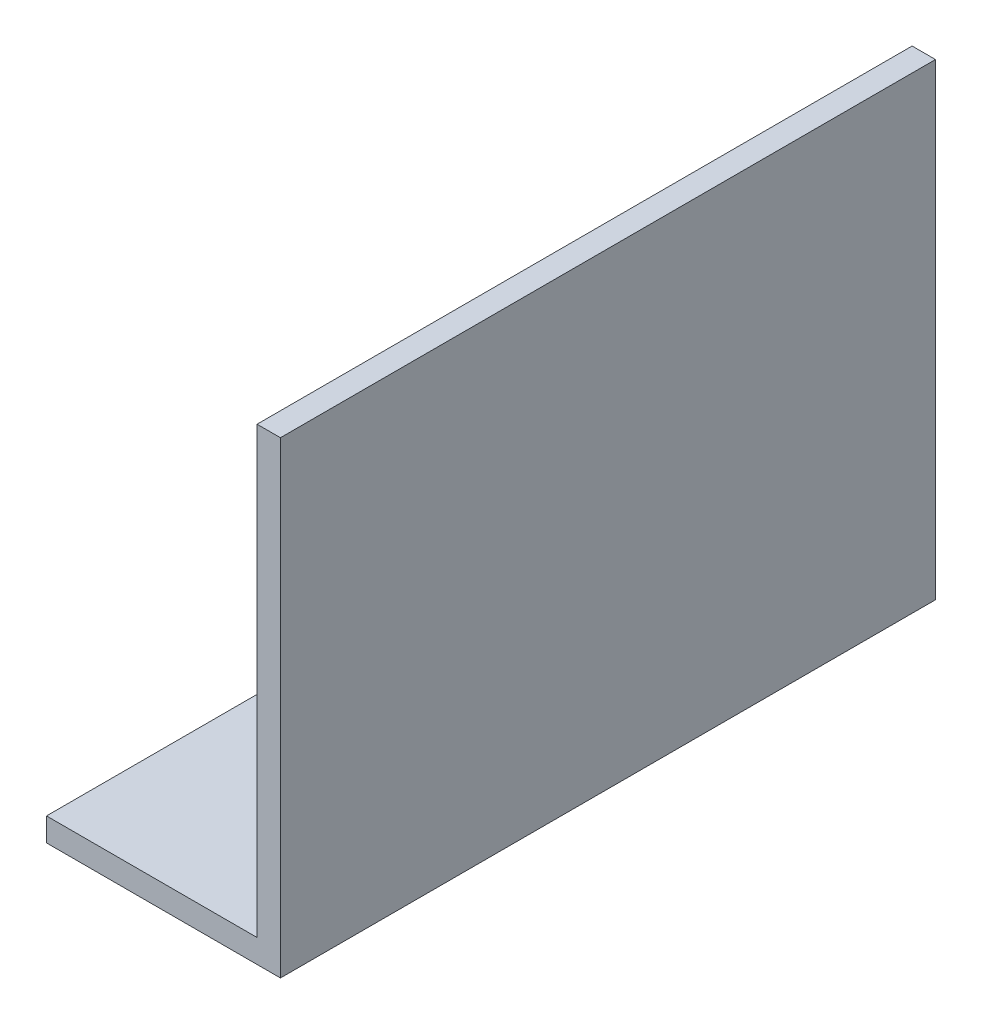
ISO-10303-21;
HEADER;
FILE_DESCRIPTION(('STEP AP214'),'2;1');
FILE_NAME('part.step','',(''),(''),'','','');
FILE_SCHEMA(('AUTOMOTIVE_DESIGN { 1 0 10303 214 1 1 1 1 }'));
ENDSEC;
DATA;
#1=APPLICATION_CONTEXT('core data for automotive mechanical design processes');
#2=APPLICATION_PROTOCOL_DEFINITION('international standard','automotive_design',2000,#1);
#3=PRODUCT_CONTEXT('',#1,'mechanical');
#4=PRODUCT('Part','Part','',(#3));
#5=PRODUCT_RELATED_PRODUCT_CATEGORY('part','',(#4));
#6=PRODUCT_DEFINITION_FORMATION('','',#4);
#7=PRODUCT_DEFINITION_CONTEXT('part definition',#1,'design');
#8=PRODUCT_DEFINITION('design','',#6,#7);
#9=PRODUCT_DEFINITION_SHAPE('','',#8);
#10=(LENGTH_UNIT() NAMED_UNIT(*) SI_UNIT(.MILLI.,.METRE.));
#11=(NAMED_UNIT(*) PLANE_ANGLE_UNIT() SI_UNIT($,.RADIAN.));
#12=(NAMED_UNIT(*) SI_UNIT($,.STERADIAN.) SOLID_ANGLE_UNIT());
#13=UNCERTAINTY_MEASURE_WITH_UNIT(LENGTH_MEASURE(1.E-05),#10,'distance_accuracy_value','');
#14=(GEOMETRIC_REPRESENTATION_CONTEXT(3) GLOBAL_UNCERTAINTY_ASSIGNED_CONTEXT((#13)) GLOBAL_UNIT_ASSIGNED_CONTEXT((#10,
#11,#12)) REPRESENTATION_CONTEXT('',''));
#15=CARTESIAN_POINT('',(0.,0.,0.));
#16=DIRECTION('',(0.,0.,1.));
#17=DIRECTION('',(1.,0.,0.));
#18=AXIS2_PLACEMENT_3D('',#15,#16,#17);
#19=CARTESIAN_POINT('',(-5.,0.,140.));
#20=DIRECTION('',(0.,-1.,0.));
#21=DIRECTION('',(0.,0.,-1.));
#22=AXIS2_PLACEMENT_3D('',#19,#20,#21);
#23=PLANE('',#22);
#24=DIRECTION('',(-1.,0.,0.));
#25=VECTOR('',#24,1.);
#26=CARTESIAN_POINT('',(-5.,0.,0.));
#27=LINE('',#26,#25);
#28=CARTESIAN_POINT('',(0.,0.,0.));
#29=VERTEX_POINT('',#28);
#30=CARTESIAN_POINT('',(-5.,0.,0.));
#31=VERTEX_POINT('',#30);
#32=EDGE_CURVE('E128',#29,#31,#27,.T.);
#33=ORIENTED_EDGE('',*,*,#32,.T.);
#34=DIRECTION('',(0.,0.,-1.));
#35=VECTOR('',#34,1.);
#36=CARTESIAN_POINT('',(-5.,0.,140.));
#37=LINE('',#36,#35);
#38=CARTESIAN_POINT('',(-5.,0.,140.));
#39=VERTEX_POINT('',#38);
#40=EDGE_CURVE('E11',#39,#31,#37,.T.);
#41=ORIENTED_EDGE('',*,*,#40,.F.);
#42=DIRECTION('',(-1.,0.,0.));
#43=VECTOR('',#42,1.);
#44=CARTESIAN_POINT('',(-5.,0.,140.));
#45=LINE('',#44,#43);
#46=CARTESIAN_POINT('',(0.,0.,140.));
#47=VERTEX_POINT('',#46);
#48=EDGE_CURVE('E144',#47,#39,#45,.T.);
#49=ORIENTED_EDGE('',*,*,#48,.F.);
#50=DIRECTION('',(0.,0.,-1.));
#51=VECTOR('',#50,1.);
#52=CARTESIAN_POINT('',(0.,0.,140.));
#53=LINE('',#52,#51);
#54=EDGE_CURVE('E124',#47,#29,#53,.T.);
#55=ORIENTED_EDGE('',*,*,#54,.T.);
#56=EDGE_LOOP('',(#33,#41,#49,#55));
#57=FACE_BOUND('',#56,.T.);
#58=ADVANCED_FACE('F39',(#57),#23,.F.);
#59=CARTESIAN_POINT('',(-5.,-95.,140.));
#60=DIRECTION('',(1.,0.,0.));
#61=DIRECTION('',(0.,1.,0.));
#62=AXIS2_PLACEMENT_3D('',#59,#60,#61);
#63=PLANE('',#62);
#64=DIRECTION('',(0.,-1.,0.));
#65=VECTOR('',#64,1.);
#66=CARTESIAN_POINT('',(-5.,-95.,0.));
#67=LINE('',#66,#65);
#68=CARTESIAN_POINT('',(-5.,-95.,0.));
#69=VERTEX_POINT('',#68);
#70=EDGE_CURVE('E132',#31,#69,#67,.T.);
#71=ORIENTED_EDGE('',*,*,#70,.T.);
#72=DIRECTION('',(0.,0.,-1.));
#73=VECTOR('',#72,1.);
#74=CARTESIAN_POINT('',(-5.,-95.,140.));
#75=LINE('',#74,#73);
#76=CARTESIAN_POINT('',(-5.,-95.,140.));
#77=VERTEX_POINT('',#76);
#78=EDGE_CURVE('E48',#77,#69,#75,.T.);
#79=ORIENTED_EDGE('',*,*,#78,.F.);
#80=DIRECTION('',(0.,-1.,0.));
#81=VECTOR('',#80,1.);
#82=CARTESIAN_POINT('',(-5.,-95.,140.));
#83=LINE('',#82,#81);
#84=EDGE_CURVE('E93',#39,#77,#83,.T.);
#85=ORIENTED_EDGE('',*,*,#84,.F.);
#86=ORIENTED_EDGE('',*,*,#40,.T.);
#87=EDGE_LOOP('',(#71,#79,#85,#86));
#88=FACE_BOUND('',#87,.T.);
#89=ADVANCED_FACE('F172',(#88),#63,.F.);
#90=CARTESIAN_POINT('',(-50.,-95.,140.));
#91=DIRECTION('',(0.,-1.,0.));
#92=DIRECTION('',(1.,0.,0.));
#93=AXIS2_PLACEMENT_3D('',#90,#91,#92);
#94=PLANE('',#93);
#95=DIRECTION('',(-1.,0.,0.));
#96=VECTOR('',#95,1.);
#97=CARTESIAN_POINT('',(-50.,-95.,0.));
#98=LINE('',#97,#96);
#99=CARTESIAN_POINT('',(-50.,-95.,0.));
#100=VERTEX_POINT('',#99);
#101=EDGE_CURVE('E135',#69,#100,#98,.T.);
#102=ORIENTED_EDGE('',*,*,#101,.T.);
#103=DIRECTION('',(0.,0.,-1.));
#104=VECTOR('',#103,1.);
#105=CARTESIAN_POINT('',(-50.,-95.,140.));
#106=LINE('',#105,#104);
#107=CARTESIAN_POINT('',(-50.,-95.,140.));
#108=VERTEX_POINT('',#107);
#109=EDGE_CURVE('E117',#108,#100,#106,.T.);
#110=ORIENTED_EDGE('',*,*,#109,.F.);
#111=DIRECTION('',(-1.,0.,0.));
#112=VECTOR('',#111,1.);
#113=CARTESIAN_POINT('',(-50.,-95.,140.));
#114=LINE('',#113,#112);
#115=EDGE_CURVE('E106',#77,#108,#114,.T.);
#116=ORIENTED_EDGE('',*,*,#115,.F.);
#117=ORIENTED_EDGE('',*,*,#78,.T.);
#118=EDGE_LOOP('',(#102,#110,#116,#117));
#119=FACE_BOUND('',#118,.T.);
#120=ADVANCED_FACE('F154',(#119),#94,.F.);
#121=CARTESIAN_POINT('',(-50.,-100.,140.));
#122=DIRECTION('',(1.,0.,0.));
#123=DIRECTION('',(0.,1.,0.));
#124=AXIS2_PLACEMENT_3D('',#121,#122,#123);
#125=PLANE('',#124);
#126=DIRECTION('',(0.,-1.,0.));
#127=VECTOR('',#126,1.);
#128=CARTESIAN_POINT('',(-50.,-100.,0.));
#129=LINE('',#128,#127);
#130=CARTESIAN_POINT('',(-50.,-100.,0.));
#131=VERTEX_POINT('',#130);
#132=EDGE_CURVE('E115',#100,#131,#129,.T.);
#133=ORIENTED_EDGE('',*,*,#132,.T.);
#134=DIRECTION('',(0.,0.,-1.));
#135=VECTOR('',#134,1.);
#136=CARTESIAN_POINT('',(-50.,-100.,140.));
#137=LINE('',#136,#135);
#138=CARTESIAN_POINT('',(-50.,-100.,140.));
#139=VERTEX_POINT('',#138);
#140=EDGE_CURVE('E112',#139,#131,#137,.T.);
#141=ORIENTED_EDGE('',*,*,#140,.F.);
#142=DIRECTION('',(0.,-1.,0.));
#143=VECTOR('',#142,1.);
#144=CARTESIAN_POINT('',(-50.,-100.,140.));
#145=LINE('',#144,#143);
#146=EDGE_CURVE('E100',#108,#139,#145,.T.);
#147=ORIENTED_EDGE('',*,*,#146,.F.);
#148=ORIENTED_EDGE('',*,*,#109,.T.);
#149=EDGE_LOOP('',(#133,#141,#147,#148));
#150=FACE_BOUND('',#149,.T.);
#151=ADVANCED_FACE('F113',(#150),#125,.F.);
#152=CARTESIAN_POINT('',(0.,-100.,140.));
#153=DIRECTION('',(0.,1.,0.));
#154=DIRECTION('',(0.,0.,1.));
#155=AXIS2_PLACEMENT_3D('',#152,#153,#154);
#156=PLANE('',#155);
#157=DIRECTION('',(1.,0.,0.));
#158=VECTOR('',#157,1.);
#159=CARTESIAN_POINT('',(0.,-100.,0.));
#160=LINE('',#159,#158);
#161=CARTESIAN_POINT('',(0.,-100.,0.));
#162=VERTEX_POINT('',#161);
#163=EDGE_CURVE('E79',#131,#162,#160,.T.);
#164=ORIENTED_EDGE('',*,*,#163,.T.);
#165=DIRECTION('',(0.,0.,-1.));
#166=VECTOR('',#165,1.);
#167=CARTESIAN_POINT('',(0.,-100.,140.));
#168=LINE('',#167,#166);
#169=CARTESIAN_POINT('',(0.,-100.,140.));
#170=VERTEX_POINT('',#169);
#171=EDGE_CURVE('E118',#170,#162,#168,.T.);
#172=ORIENTED_EDGE('',*,*,#171,.F.);
#173=DIRECTION('',(1.,0.,0.));
#174=VECTOR('',#173,1.);
#175=CARTESIAN_POINT('',(0.,-100.,140.));
#176=LINE('',#175,#174);
#177=EDGE_CURVE('E104',#139,#170,#176,.T.);
#178=ORIENTED_EDGE('',*,*,#177,.F.);
#179=ORIENTED_EDGE('',*,*,#140,.T.);
#180=EDGE_LOOP('',(#164,#172,#178,#179));
#181=FACE_BOUND('',#180,.T.);
#182=ADVANCED_FACE('F120',(#181),#156,.F.);
#183=CARTESIAN_POINT('',(0.,0.,140.));
#184=DIRECTION('',(-1.,0.,0.));
#185=DIRECTION('',(0.,-1.,0.));
#186=AXIS2_PLACEMENT_3D('',#183,#184,#185);
#187=PLANE('',#186);
#188=DIRECTION('',(0.,1.,0.));
#189=VECTOR('',#188,1.);
#190=CARTESIAN_POINT('',(0.,0.,0.));
#191=LINE('',#190,#189);
#192=EDGE_CURVE('E85',#162,#29,#191,.T.);
#193=ORIENTED_EDGE('',*,*,#192,.T.);
#194=ORIENTED_EDGE('',*,*,#54,.F.);
#195=DIRECTION('',(0.,1.,0.));
#196=VECTOR('',#195,1.);
#197=CARTESIAN_POINT('',(0.,0.,140.));
#198=LINE('',#197,#196);
#199=EDGE_CURVE('E56',#170,#47,#198,.T.);
#200=ORIENTED_EDGE('',*,*,#199,.F.);
#201=ORIENTED_EDGE('',*,*,#171,.T.);
#202=EDGE_LOOP('',(#193,#194,#200,#201));
#203=FACE_BOUND('',#202,.T.);
#204=ADVANCED_FACE('F161',(#203),#187,.F.);
#205=CARTESIAN_POINT('',(0.,0.,140.));
#206=DIRECTION('',(0.,0.,-1.));
#207=DIRECTION('',(-1.,0.,0.));
#208=AXIS2_PLACEMENT_3D('',#205,#206,#207);
#209=PLANE('',#208);
#210=ORIENTED_EDGE('',*,*,#48,.T.);
#211=ORIENTED_EDGE('',*,*,#84,.T.);
#212=ORIENTED_EDGE('',*,*,#115,.T.);
#213=ORIENTED_EDGE('',*,*,#146,.T.);
#214=ORIENTED_EDGE('',*,*,#177,.T.);
#215=ORIENTED_EDGE('',*,*,#199,.T.);
#216=EDGE_LOOP('',(#210,#211,#212,#213,#214,#215));
#217=FACE_BOUND('',#216,.T.);
#218=ADVANCED_FACE('F102',(#217),#209,.F.);
#219=CARTESIAN_POINT('',(0.,0.,0.));
#220=DIRECTION('',(0.,0.,-1.));
#221=DIRECTION('',(-1.,0.,0.));
#222=AXIS2_PLACEMENT_3D('',#219,#220,#221);
#223=PLANE('',#222);
#224=ORIENTED_EDGE('',*,*,#32,.F.);
#225=ORIENTED_EDGE('',*,*,#192,.F.);
#226=ORIENTED_EDGE('',*,*,#163,.F.);
#227=ORIENTED_EDGE('',*,*,#132,.F.);
#228=ORIENTED_EDGE('',*,*,#101,.F.);
#229=ORIENTED_EDGE('',*,*,#70,.F.);
#230=EDGE_LOOP('',(#224,#225,#226,#227,#228,#229));
#231=FACE_BOUND('',#230,.T.);
#232=ADVANCED_FACE('F157',(#231),#223,.T.);
#233=CLOSED_SHELL('',(#58,#89,#120,#151,#182,#204,#218,#232));
#234=MANIFOLD_SOLID_BREP('B2',#233);
#235=ADVANCED_BREP_SHAPE_REPRESENTATION('',(#18,#234),#14);
#236=SHAPE_DEFINITION_REPRESENTATION(#9,#235);
ENDSEC;
END-ISO-10303-21;
